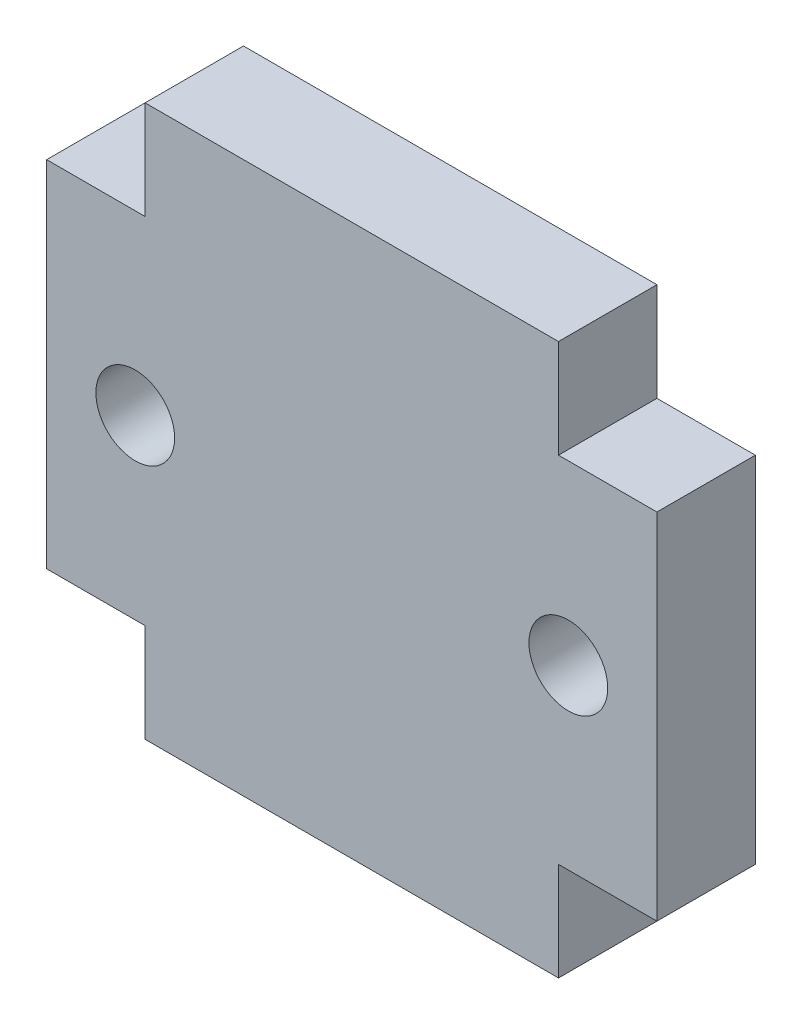
ISO-10303-21;
HEADER;
FILE_DESCRIPTION(('STEP AP214'),'2;1');
FILE_NAME('part.step','',(''),(''),'','','');
FILE_SCHEMA(('AUTOMOTIVE_DESIGN { 1 0 10303 214 1 1 1 1 }'));
ENDSEC;
DATA;
#1=APPLICATION_CONTEXT('core data for automotive mechanical design processes');
#2=APPLICATION_PROTOCOL_DEFINITION('international standard','automotive_design',2000,#1);
#3=PRODUCT_CONTEXT('',#1,'mechanical');
#4=PRODUCT('Part','Part','',(#3));
#5=PRODUCT_RELATED_PRODUCT_CATEGORY('part','',(#4));
#6=PRODUCT_DEFINITION_FORMATION('','',#4);
#7=PRODUCT_DEFINITION_CONTEXT('part definition',#1,'design');
#8=PRODUCT_DEFINITION('design','',#6,#7);
#9=PRODUCT_DEFINITION_SHAPE('','',#8);
#10=(LENGTH_UNIT() NAMED_UNIT(*) SI_UNIT(.MILLI.,.METRE.));
#11=(NAMED_UNIT(*) PLANE_ANGLE_UNIT() SI_UNIT($,.RADIAN.));
#12=(NAMED_UNIT(*) SI_UNIT($,.STERADIAN.) SOLID_ANGLE_UNIT());
#13=UNCERTAINTY_MEASURE_WITH_UNIT(LENGTH_MEASURE(1.E-05),#10,'distance_accuracy_value','');
#14=(GEOMETRIC_REPRESENTATION_CONTEXT(3) GLOBAL_UNCERTAINTY_ASSIGNED_CONTEXT((#13)) GLOBAL_UNIT_ASSIGNED_CONTEXT((#10,
#11,#12)) REPRESENTATION_CONTEXT('',''));
#15=CARTESIAN_POINT('',(0.,0.,0.));
#16=DIRECTION('',(0.,0.,1.));
#17=DIRECTION('',(1.,0.,0.));
#18=AXIS2_PLACEMENT_3D('',#15,#16,#17);
#19=CARTESIAN_POINT('',(0.,0.,5.));
#20=DIRECTION('',(0.,0.,-1.));
#21=DIRECTION('',(-1.,0.,0.));
#22=AXIS2_PLACEMENT_3D('',#19,#20,#21);
#23=PLANE('',#22);
#24=DIRECTION('',(0.,-1.,0.));
#25=VECTOR('',#24,1.);
#26=CARTESIAN_POINT('',(-10.5,9.,5.));
#27=LINE('',#26,#25);
#28=CARTESIAN_POINT('',(-10.5,14.,5.));
#29=VERTEX_POINT('',#28);
#30=CARTESIAN_POINT('',(-10.5,9.,5.));
#31=VERTEX_POINT('',#30);
#32=EDGE_CURVE('E177',#29,#31,#27,.T.);
#33=ORIENTED_EDGE('',*,*,#32,.T.);
#34=DIRECTION('',(-1.,0.,0.));
#35=VECTOR('',#34,1.);
#36=CARTESIAN_POINT('',(-15.5,9.,5.));
#37=LINE('',#36,#35);
#38=CARTESIAN_POINT('',(-15.5,9.,5.));
#39=VERTEX_POINT('',#38);
#40=EDGE_CURVE('E105',#31,#39,#37,.T.);
#41=ORIENTED_EDGE('',*,*,#40,.T.);
#42=DIRECTION('',(0.,-1.,0.));
#43=VECTOR('',#42,1.);
#44=CARTESIAN_POINT('',(-15.5,-9.,5.));
#45=LINE('',#44,#43);
#46=CARTESIAN_POINT('',(-15.5,-9.,5.));
#47=VERTEX_POINT('',#46);
#48=EDGE_CURVE('E204',#39,#47,#45,.T.);
#49=ORIENTED_EDGE('',*,*,#48,.T.);
#50=DIRECTION('',(1.,0.,0.));
#51=VECTOR('',#50,1.);
#52=CARTESIAN_POINT('',(-15.5,-9.,5.));
#53=LINE('',#52,#51);
#54=CARTESIAN_POINT('',(-10.5,-9.,5.));
#55=VERTEX_POINT('',#54);
#56=EDGE_CURVE('E223',#47,#55,#53,.T.);
#57=ORIENTED_EDGE('',*,*,#56,.T.);
#58=DIRECTION('',(0.,-1.,0.));
#59=VECTOR('',#58,1.);
#60=CARTESIAN_POINT('',(-10.5,-9.,5.));
#61=LINE('',#60,#59);
#62=CARTESIAN_POINT('',(-10.5,-14.,5.));
#63=VERTEX_POINT('',#62);
#64=EDGE_CURVE('E220',#55,#63,#61,.T.);
#65=ORIENTED_EDGE('',*,*,#64,.T.);
#66=DIRECTION('',(1.,0.,0.));
#67=VECTOR('',#66,1.);
#68=CARTESIAN_POINT('',(-10.5,-14.,5.));
#69=LINE('',#68,#67);
#70=CARTESIAN_POINT('',(10.5,-14.,5.));
#71=VERTEX_POINT('',#70);
#72=EDGE_CURVE('E222',#63,#71,#69,.T.);
#73=ORIENTED_EDGE('',*,*,#72,.T.);
#74=DIRECTION('',(0.,1.,0.));
#75=VECTOR('',#74,1.);
#76=CARTESIAN_POINT('',(10.5,-9.,5.));
#77=LINE('',#76,#75);
#78=CARTESIAN_POINT('',(10.5,-9.,5.));
#79=VERTEX_POINT('',#78);
#80=EDGE_CURVE('E225',#71,#79,#77,.T.);
#81=ORIENTED_EDGE('',*,*,#80,.T.);
#82=DIRECTION('',(1.,0.,0.));
#83=VECTOR('',#82,1.);
#84=CARTESIAN_POINT('',(15.5,-9.,5.));
#85=LINE('',#84,#83);
#86=CARTESIAN_POINT('',(15.5,-9.,5.));
#87=VERTEX_POINT('',#86);
#88=EDGE_CURVE('E231',#79,#87,#85,.T.);
#89=ORIENTED_EDGE('',*,*,#88,.T.);
#90=DIRECTION('',(0.,1.,0.));
#91=VECTOR('',#90,1.);
#92=CARTESIAN_POINT('',(15.5,-9.,5.));
#93=LINE('',#92,#91);
#94=CARTESIAN_POINT('',(15.5,9.,5.));
#95=VERTEX_POINT('',#94);
#96=EDGE_CURVE('E136',#87,#95,#93,.T.);
#97=ORIENTED_EDGE('',*,*,#96,.T.);
#98=DIRECTION('',(-1.,0.,0.));
#99=VECTOR('',#98,1.);
#100=CARTESIAN_POINT('',(15.5,9.,5.));
#101=LINE('',#100,#99);
#102=CARTESIAN_POINT('',(10.5,9.,5.));
#103=VERTEX_POINT('',#102);
#104=EDGE_CURVE('E130',#95,#103,#101,.T.);
#105=ORIENTED_EDGE('',*,*,#104,.T.);
#106=DIRECTION('',(0.,1.,0.));
#107=VECTOR('',#106,1.);
#108=CARTESIAN_POINT('',(10.5,9.,5.));
#109=LINE('',#108,#107);
#110=CARTESIAN_POINT('',(10.5,14.,5.));
#111=VERTEX_POINT('',#110);
#112=EDGE_CURVE('E134',#103,#111,#109,.T.);
#113=ORIENTED_EDGE('',*,*,#112,.T.);
#114=DIRECTION('',(-1.,0.,0.));
#115=VECTOR('',#114,1.);
#116=CARTESIAN_POINT('',(-10.5,14.,5.));
#117=LINE('',#116,#115);
#118=EDGE_CURVE('E50',#111,#29,#117,.T.);
#119=ORIENTED_EDGE('',*,*,#118,.T.);
#120=EDGE_LOOP('',(#33,#41,#49,#57,#65,#73,#81,#89,#97,#105,#113,#119));
#121=FACE_BOUND('',#120,.T.);
#122=CARTESIAN_POINT('',(-11.,0.,5.));
#123=DIRECTION('',(0.,0.,1.));
#124=DIRECTION('',(1.,0.,0.));
#125=AXIS2_PLACEMENT_3D('',#122,#123,#124);
#126=CIRCLE('',#125,2.);
#127=CARTESIAN_POINT('',(-9.,0.,5.));
#128=VERTEX_POINT('',#127);
#129=EDGE_CURVE('E158',#128,#128,#126,.T.);
#130=ORIENTED_EDGE('',*,*,#129,.F.);
#131=EDGE_LOOP('',(#130));
#132=FACE_BOUND('',#131,.T.);
#133=CARTESIAN_POINT('',(11.,0.,5.));
#134=DIRECTION('',(0.,0.,1.));
#135=DIRECTION('',(-1.,0.,0.));
#136=AXIS2_PLACEMENT_3D('',#133,#134,#135);
#137=CIRCLE('',#136,2.);
#138=CARTESIAN_POINT('',(9.,0.,5.));
#139=VERTEX_POINT('',#138);
#140=EDGE_CURVE('E272',#139,#139,#137,.T.);
#141=ORIENTED_EDGE('',*,*,#140,.F.);
#142=EDGE_LOOP('',(#141));
#143=FACE_BOUND('',#142,.T.);
#144=ADVANCED_FACE('F33',(#121,#132,#143),#23,.F.);
#145=CARTESIAN_POINT('',(0.,0.,0.));
#146=DIRECTION('',(0.,0.,-1.));
#147=DIRECTION('',(-1.,0.,0.));
#148=AXIS2_PLACEMENT_3D('',#145,#146,#147);
#149=PLANE('',#148);
#150=CARTESIAN_POINT('',(-11.,0.,0.));
#151=DIRECTION('',(0.,0.,1.));
#152=DIRECTION('',(1.,0.,0.));
#153=AXIS2_PLACEMENT_3D('',#150,#151,#152);
#154=CIRCLE('',#153,2.);
#155=CARTESIAN_POINT('',(-9.,0.,0.));
#156=VERTEX_POINT('',#155);
#157=EDGE_CURVE('E277',#156,#156,#154,.T.);
#158=ORIENTED_EDGE('',*,*,#157,.T.);
#159=EDGE_LOOP('',(#158));
#160=FACE_BOUND('',#159,.T.);
#161=DIRECTION('',(0.,-1.,0.));
#162=VECTOR('',#161,1.);
#163=CARTESIAN_POINT('',(-10.5,9.,0.));
#164=LINE('',#163,#162);
#165=CARTESIAN_POINT('',(-10.5,14.,0.));
#166=VERTEX_POINT('',#165);
#167=CARTESIAN_POINT('',(-10.5,9.,0.));
#168=VERTEX_POINT('',#167);
#169=EDGE_CURVE('E154',#166,#168,#164,.T.);
#170=ORIENTED_EDGE('',*,*,#169,.F.);
#171=DIRECTION('',(-1.,0.,0.));
#172=VECTOR('',#171,1.);
#173=CARTESIAN_POINT('',(-10.5,14.,0.));
#174=LINE('',#173,#172);
#175=CARTESIAN_POINT('',(10.5,14.,0.));
#176=VERTEX_POINT('',#175);
#177=EDGE_CURVE('E97',#176,#166,#174,.T.);
#178=ORIENTED_EDGE('',*,*,#177,.F.);
#179=DIRECTION('',(0.,1.,0.));
#180=VECTOR('',#179,1.);
#181=CARTESIAN_POINT('',(10.5,9.,0.));
#182=LINE('',#181,#180);
#183=CARTESIAN_POINT('',(10.5,9.,0.));
#184=VERTEX_POINT('',#183);
#185=EDGE_CURVE('E91',#184,#176,#182,.T.);
#186=ORIENTED_EDGE('',*,*,#185,.F.);
#187=DIRECTION('',(-1.,0.,0.));
#188=VECTOR('',#187,1.);
#189=CARTESIAN_POINT('',(15.5,9.,0.));
#190=LINE('',#189,#188);
#191=CARTESIAN_POINT('',(15.5,9.,0.));
#192=VERTEX_POINT('',#191);
#193=EDGE_CURVE('E144',#192,#184,#190,.T.);
#194=ORIENTED_EDGE('',*,*,#193,.F.);
#195=DIRECTION('',(0.,1.,0.));
#196=VECTOR('',#195,1.);
#197=CARTESIAN_POINT('',(15.5,-9.,0.));
#198=LINE('',#197,#196);
#199=CARTESIAN_POINT('',(15.5,-9.,0.));
#200=VERTEX_POINT('',#199);
#201=EDGE_CURVE('E172',#200,#192,#198,.T.);
#202=ORIENTED_EDGE('',*,*,#201,.F.);
#203=DIRECTION('',(1.,0.,0.));
#204=VECTOR('',#203,1.);
#205=CARTESIAN_POINT('',(15.5,-9.,0.));
#206=LINE('',#205,#204);
#207=CARTESIAN_POINT('',(10.5,-9.,0.));
#208=VERTEX_POINT('',#207);
#209=EDGE_CURVE('E170',#208,#200,#206,.T.);
#210=ORIENTED_EDGE('',*,*,#209,.F.);
#211=DIRECTION('',(0.,1.,0.));
#212=VECTOR('',#211,1.);
#213=CARTESIAN_POINT('',(10.5,-9.,0.));
#214=LINE('',#213,#212);
#215=CARTESIAN_POINT('',(10.5,-14.,0.));
#216=VERTEX_POINT('',#215);
#217=EDGE_CURVE('E168',#216,#208,#214,.T.);
#218=ORIENTED_EDGE('',*,*,#217,.F.);
#219=DIRECTION('',(1.,0.,0.));
#220=VECTOR('',#219,1.);
#221=CARTESIAN_POINT('',(-10.5,-14.,0.));
#222=LINE('',#221,#220);
#223=CARTESIAN_POINT('',(-10.5,-14.,0.));
#224=VERTEX_POINT('',#223);
#225=EDGE_CURVE('E166',#224,#216,#222,.T.);
#226=ORIENTED_EDGE('',*,*,#225,.F.);
#227=DIRECTION('',(0.,-1.,0.));
#228=VECTOR('',#227,1.);
#229=CARTESIAN_POINT('',(-10.5,-9.,0.));
#230=LINE('',#229,#228);
#231=CARTESIAN_POINT('',(-10.5,-9.,0.));
#232=VERTEX_POINT('',#231);
#233=EDGE_CURVE('E164',#232,#224,#230,.T.);
#234=ORIENTED_EDGE('',*,*,#233,.F.);
#235=DIRECTION('',(1.,0.,0.));
#236=VECTOR('',#235,1.);
#237=CARTESIAN_POINT('',(-15.5,-9.,0.));
#238=LINE('',#237,#236);
#239=CARTESIAN_POINT('',(-15.5,-9.,0.));
#240=VERTEX_POINT('',#239);
#241=EDGE_CURVE('E162',#240,#232,#238,.T.);
#242=ORIENTED_EDGE('',*,*,#241,.F.);
#243=DIRECTION('',(0.,-1.,0.));
#244=VECTOR('',#243,1.);
#245=CARTESIAN_POINT('',(-15.5,-9.,0.));
#246=LINE('',#245,#244);
#247=CARTESIAN_POINT('',(-15.5,9.,0.));
#248=VERTEX_POINT('',#247);
#249=EDGE_CURVE('E160',#248,#240,#246,.T.);
#250=ORIENTED_EDGE('',*,*,#249,.F.);
#251=DIRECTION('',(-1.,0.,0.));
#252=VECTOR('',#251,1.);
#253=CARTESIAN_POINT('',(-15.5,9.,0.));
#254=LINE('',#253,#252);
#255=EDGE_CURVE('E157',#168,#248,#254,.T.);
#256=ORIENTED_EDGE('',*,*,#255,.F.);
#257=EDGE_LOOP('',(#170,#178,#186,#194,#202,#210,#218,#226,#234,#242,#250,#256));
#258=FACE_BOUND('',#257,.T.);
#259=CARTESIAN_POINT('',(11.,0.,0.));
#260=DIRECTION('',(0.,0.,1.));
#261=DIRECTION('',(-1.,0.,0.));
#262=AXIS2_PLACEMENT_3D('',#259,#260,#261);
#263=CIRCLE('',#262,2.);
#264=CARTESIAN_POINT('',(9.,0.,0.));
#265=VERTEX_POINT('',#264);
#266=EDGE_CURVE('E275',#265,#265,#263,.T.);
#267=ORIENTED_EDGE('',*,*,#266,.T.);
#268=EDGE_LOOP('',(#267));
#269=FACE_BOUND('',#268,.T.);
#270=ADVANCED_FACE('F208',(#160,#258,#269),#149,.T.);
#271=CARTESIAN_POINT('',(-10.5,9.,5.));
#272=DIRECTION('',(1.,0.,0.));
#273=DIRECTION('',(0.,0.,-1.));
#274=AXIS2_PLACEMENT_3D('',#271,#272,#273);
#275=PLANE('',#274);
#276=ORIENTED_EDGE('',*,*,#169,.T.);
#277=DIRECTION('',(0.,0.,-1.));
#278=VECTOR('',#277,1.);
#279=CARTESIAN_POINT('',(-10.5,9.,5.));
#280=LINE('',#279,#278);
#281=EDGE_CURVE('E11',#31,#168,#280,.T.);
#282=ORIENTED_EDGE('',*,*,#281,.F.);
#283=ORIENTED_EDGE('',*,*,#32,.F.);
#284=DIRECTION('',(0.,0.,-1.));
#285=VECTOR('',#284,1.);
#286=CARTESIAN_POINT('',(-10.5,14.,5.));
#287=LINE('',#286,#285);
#288=EDGE_CURVE('E150',#29,#166,#287,.T.);
#289=ORIENTED_EDGE('',*,*,#288,.T.);
#290=EDGE_LOOP('',(#276,#282,#283,#289));
#291=FACE_BOUND('',#290,.T.);
#292=ADVANCED_FACE('F35',(#291),#275,.F.);
#293=CARTESIAN_POINT('',(-15.5,9.,5.));
#294=DIRECTION('',(0.,-1.,0.));
#295=DIRECTION('',(1.,0.,0.));
#296=AXIS2_PLACEMENT_3D('',#293,#294,#295);
#297=PLANE('',#296);
#298=ORIENTED_EDGE('',*,*,#255,.T.);
#299=DIRECTION('',(0.,0.,-1.));
#300=VECTOR('',#299,1.);
#301=CARTESIAN_POINT('',(-15.5,9.,5.));
#302=LINE('',#301,#300);
#303=EDGE_CURVE('E42',#39,#248,#302,.T.);
#304=ORIENTED_EDGE('',*,*,#303,.F.);
#305=ORIENTED_EDGE('',*,*,#40,.F.);
#306=ORIENTED_EDGE('',*,*,#281,.T.);
#307=EDGE_LOOP('',(#298,#304,#305,#306));
#308=FACE_BOUND('',#307,.T.);
#309=ADVANCED_FACE('F372',(#308),#297,.F.);
#310=CARTESIAN_POINT('',(-15.5,-9.,5.));
#311=DIRECTION('',(1.,0.,0.));
#312=DIRECTION('',(0.,1.,0.));
#313=AXIS2_PLACEMENT_3D('',#310,#311,#312);
#314=PLANE('',#313);
#315=ORIENTED_EDGE('',*,*,#249,.T.);
#316=DIRECTION('',(0.,0.,-1.));
#317=VECTOR('',#316,1.);
#318=CARTESIAN_POINT('',(-15.5,-9.,5.));
#319=LINE('',#318,#317);
#320=EDGE_CURVE('E196',#47,#240,#319,.T.);
#321=ORIENTED_EDGE('',*,*,#320,.F.);
#322=ORIENTED_EDGE('',*,*,#48,.F.);
#323=ORIENTED_EDGE('',*,*,#303,.T.);
#324=EDGE_LOOP('',(#315,#321,#322,#323));
#325=FACE_BOUND('',#324,.T.);
#326=ADVANCED_FACE('F202',(#325),#314,.F.);
#327=CARTESIAN_POINT('',(-15.5,-9.,5.));
#328=DIRECTION('',(0.,1.,0.));
#329=DIRECTION('',(-1.,0.,0.));
#330=AXIS2_PLACEMENT_3D('',#327,#328,#329);
#331=PLANE('',#330);
#332=ORIENTED_EDGE('',*,*,#241,.T.);
#333=DIRECTION('',(0.,0.,-1.));
#334=VECTOR('',#333,1.);
#335=CARTESIAN_POINT('',(-10.5,-9.,5.));
#336=LINE('',#335,#334);
#337=EDGE_CURVE('E193',#55,#232,#336,.T.);
#338=ORIENTED_EDGE('',*,*,#337,.F.);
#339=ORIENTED_EDGE('',*,*,#56,.F.);
#340=ORIENTED_EDGE('',*,*,#320,.T.);
#341=EDGE_LOOP('',(#332,#338,#339,#340));
#342=FACE_BOUND('',#341,.T.);
#343=ADVANCED_FACE('F214',(#342),#331,.F.);
#344=CARTESIAN_POINT('',(-10.5,-9.,5.));
#345=DIRECTION('',(1.,0.,0.));
#346=DIRECTION('',(0.,0.,-1.));
#347=AXIS2_PLACEMENT_3D('',#344,#345,#346);
#348=PLANE('',#347);
#349=ORIENTED_EDGE('',*,*,#233,.T.);
#350=DIRECTION('',(0.,0.,-1.));
#351=VECTOR('',#350,1.);
#352=CARTESIAN_POINT('',(-10.5,-14.,5.));
#353=LINE('',#352,#351);
#354=EDGE_CURVE('E190',#63,#224,#353,.T.);
#355=ORIENTED_EDGE('',*,*,#354,.F.);
#356=ORIENTED_EDGE('',*,*,#64,.F.);
#357=ORIENTED_EDGE('',*,*,#337,.T.);
#358=EDGE_LOOP('',(#349,#355,#356,#357));
#359=FACE_BOUND('',#358,.T.);
#360=ADVANCED_FACE('F218',(#359),#348,.F.);
#361=CARTESIAN_POINT('',(-10.5,-14.,5.));
#362=DIRECTION('',(0.,1.,0.));
#363=DIRECTION('',(0.,0.,1.));
#364=AXIS2_PLACEMENT_3D('',#361,#362,#363);
#365=PLANE('',#364);
#366=ORIENTED_EDGE('',*,*,#225,.T.);
#367=DIRECTION('',(0.,0.,-1.));
#368=VECTOR('',#367,1.);
#369=CARTESIAN_POINT('',(10.5,-14.,5.));
#370=LINE('',#369,#368);
#371=EDGE_CURVE('E187',#71,#216,#370,.T.);
#372=ORIENTED_EDGE('',*,*,#371,.F.);
#373=ORIENTED_EDGE('',*,*,#72,.F.);
#374=ORIENTED_EDGE('',*,*,#354,.T.);
#375=EDGE_LOOP('',(#366,#372,#373,#374));
#376=FACE_BOUND('',#375,.T.);
#377=ADVANCED_FACE('F337',(#376),#365,.F.);
#378=CARTESIAN_POINT('',(10.5,-9.,5.));
#379=DIRECTION('',(-1.,0.,0.));
#380=DIRECTION('',(0.,0.,1.));
#381=AXIS2_PLACEMENT_3D('',#378,#379,#380);
#382=PLANE('',#381);
#383=ORIENTED_EDGE('',*,*,#217,.T.);
#384=DIRECTION('',(0.,0.,-1.));
#385=VECTOR('',#384,1.);
#386=CARTESIAN_POINT('',(10.5,-9.,5.));
#387=LINE('',#386,#385);
#388=EDGE_CURVE('E184',#79,#208,#387,.T.);
#389=ORIENTED_EDGE('',*,*,#388,.F.);
#390=ORIENTED_EDGE('',*,*,#80,.F.);
#391=ORIENTED_EDGE('',*,*,#371,.T.);
#392=EDGE_LOOP('',(#383,#389,#390,#391));
#393=FACE_BOUND('',#392,.T.);
#394=ADVANCED_FACE('F328',(#393),#382,.F.);
#395=CARTESIAN_POINT('',(15.5,-9.,5.));
#396=DIRECTION('',(0.,1.,0.));
#397=DIRECTION('',(-1.,0.,0.));
#398=AXIS2_PLACEMENT_3D('',#395,#396,#397);
#399=PLANE('',#398);
#400=ORIENTED_EDGE('',*,*,#209,.T.);
#401=DIRECTION('',(0.,0.,-1.));
#402=VECTOR('',#401,1.);
#403=CARTESIAN_POINT('',(15.5,-9.,5.));
#404=LINE('',#403,#402);
#405=EDGE_CURVE('E181',#87,#200,#404,.T.);
#406=ORIENTED_EDGE('',*,*,#405,.F.);
#407=ORIENTED_EDGE('',*,*,#88,.F.);
#408=ORIENTED_EDGE('',*,*,#388,.T.);
#409=EDGE_LOOP('',(#400,#406,#407,#408));
#410=FACE_BOUND('',#409,.T.);
#411=ADVANCED_FACE('F237',(#410),#399,.F.);
#412=CARTESIAN_POINT('',(15.5,-9.,5.));
#413=DIRECTION('',(-1.,0.,0.));
#414=DIRECTION('',(0.,0.,1.));
#415=AXIS2_PLACEMENT_3D('',#412,#413,#414);
#416=PLANE('',#415);
#417=ORIENTED_EDGE('',*,*,#201,.T.);
#418=DIRECTION('',(0.,0.,-1.));
#419=VECTOR('',#418,1.);
#420=CARTESIAN_POINT('',(15.5,9.,5.));
#421=LINE('',#420,#419);
#422=EDGE_CURVE('E145',#95,#192,#421,.T.);
#423=ORIENTED_EDGE('',*,*,#422,.F.);
#424=ORIENTED_EDGE('',*,*,#96,.F.);
#425=ORIENTED_EDGE('',*,*,#405,.T.);
#426=EDGE_LOOP('',(#417,#423,#424,#425));
#427=FACE_BOUND('',#426,.T.);
#428=ADVANCED_FACE('F241',(#427),#416,.F.);
#429=CARTESIAN_POINT('',(15.5,9.,5.));
#430=DIRECTION('',(0.,-1.,0.));
#431=DIRECTION('',(1.,0.,0.));
#432=AXIS2_PLACEMENT_3D('',#429,#430,#431);
#433=PLANE('',#432);
#434=ORIENTED_EDGE('',*,*,#193,.T.);
#435=DIRECTION('',(0.,0.,-1.));
#436=VECTOR('',#435,1.);
#437=CARTESIAN_POINT('',(10.5,9.,5.));
#438=LINE('',#437,#436);
#439=EDGE_CURVE('E141',#103,#184,#438,.T.);
#440=ORIENTED_EDGE('',*,*,#439,.F.);
#441=ORIENTED_EDGE('',*,*,#104,.F.);
#442=ORIENTED_EDGE('',*,*,#422,.T.);
#443=EDGE_LOOP('',(#434,#440,#441,#442));
#444=FACE_BOUND('',#443,.T.);
#445=ADVANCED_FACE('F142',(#444),#433,.F.);
#446=CARTESIAN_POINT('',(10.5,9.,5.));
#447=DIRECTION('',(-1.,0.,0.));
#448=DIRECTION('',(0.,0.,1.));
#449=AXIS2_PLACEMENT_3D('',#446,#447,#448);
#450=PLANE('',#449);
#451=ORIENTED_EDGE('',*,*,#185,.T.);
#452=DIRECTION('',(0.,0.,-1.));
#453=VECTOR('',#452,1.);
#454=CARTESIAN_POINT('',(10.5,14.,5.));
#455=LINE('',#454,#453);
#456=EDGE_CURVE('E146',#111,#176,#455,.T.);
#457=ORIENTED_EDGE('',*,*,#456,.F.);
#458=ORIENTED_EDGE('',*,*,#112,.F.);
#459=ORIENTED_EDGE('',*,*,#439,.T.);
#460=EDGE_LOOP('',(#451,#457,#458,#459));
#461=FACE_BOUND('',#460,.T.);
#462=ADVANCED_FACE('F148',(#461),#450,.F.);
#463=CARTESIAN_POINT('',(-10.5,14.,5.));
#464=DIRECTION('',(0.,-1.,0.));
#465=DIRECTION('',(0.,0.,-1.));
#466=AXIS2_PLACEMENT_3D('',#463,#464,#465);
#467=PLANE('',#466);
#468=ORIENTED_EDGE('',*,*,#177,.T.);
#469=ORIENTED_EDGE('',*,*,#288,.F.);
#470=ORIENTED_EDGE('',*,*,#118,.F.);
#471=ORIENTED_EDGE('',*,*,#456,.T.);
#472=EDGE_LOOP('',(#468,#469,#470,#471));
#473=FACE_BOUND('',#472,.T.);
#474=ADVANCED_FACE('F245',(#473),#467,.F.);
#475=CARTESIAN_POINT('',(-11.,0.,5.));
#476=DIRECTION('',(0.,0.,-1.));
#477=DIRECTION('',(-1.,0.,0.));
#478=AXIS2_PLACEMENT_3D('',#475,#476,#477);
#479=CYLINDRICAL_SURFACE('',#478,2.);
#480=ORIENTED_EDGE('',*,*,#129,.T.);
#481=EDGE_LOOP('',(#480));
#482=FACE_BOUND('',#481,.T.);
#483=ORIENTED_EDGE('',*,*,#157,.F.);
#484=EDGE_LOOP('',(#483));
#485=FACE_BOUND('',#484,.T.);
#486=ADVANCED_FACE('F247',(#482,#485),#479,.F.);
#487=CARTESIAN_POINT('',(11.,0.,5.));
#488=DIRECTION('',(0.,0.,-1.));
#489=DIRECTION('',(-1.,0.,0.));
#490=AXIS2_PLACEMENT_3D('',#487,#488,#489);
#491=CYLINDRICAL_SURFACE('',#490,2.);
#492=ORIENTED_EDGE('',*,*,#140,.T.);
#493=EDGE_LOOP('',(#492));
#494=FACE_BOUND('',#493,.T.);
#495=ORIENTED_EDGE('',*,*,#266,.F.);
#496=EDGE_LOOP('',(#495));
#497=FACE_BOUND('',#496,.T.);
#498=ADVANCED_FACE('F253',(#494,#497),#491,.F.);
#499=CLOSED_SHELL('',(#144,#270,#292,#309,#326,#343,#360,#377,#394,#411,#428,#445,#462,#474,
#486,#498));
#500=MANIFOLD_SOLID_BREP('B2',#499);
#501=ADVANCED_BREP_SHAPE_REPRESENTATION('',(#18,#500),#14);
#502=SHAPE_DEFINITION_REPRESENTATION(#9,#501);
ENDSEC;
END-ISO-10303-21;
